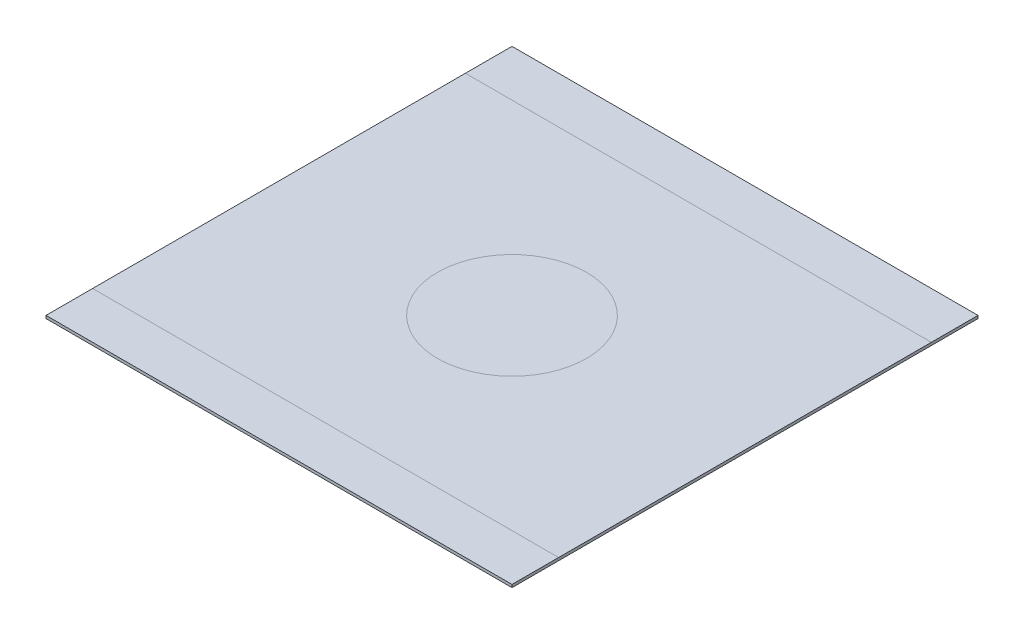
ISO-10303-21;
HEADER;
FILE_DESCRIPTION(('STEP AP214'),'2;1');
FILE_NAME('part.step','',(''),(''),'','','');
FILE_SCHEMA(('AUTOMOTIVE_DESIGN { 1 0 10303 214 1 1 1 1 }'));
ENDSEC;
DATA;
#1=APPLICATION_CONTEXT('core data for automotive mechanical design processes');
#2=APPLICATION_PROTOCOL_DEFINITION('international standard','automotive_design',2000,#1);
#3=PRODUCT_CONTEXT('',#1,'mechanical');
#4=PRODUCT('Part','Part','',(#3));
#5=PRODUCT_RELATED_PRODUCT_CATEGORY('part','',(#4));
#6=PRODUCT_DEFINITION_FORMATION('','',#4);
#7=PRODUCT_DEFINITION_CONTEXT('part definition',#1,'design');
#8=PRODUCT_DEFINITION('design','',#6,#7);
#9=PRODUCT_DEFINITION_SHAPE('','',#8);
#10=(LENGTH_UNIT() NAMED_UNIT(*) SI_UNIT(.MILLI.,.METRE.));
#11=(NAMED_UNIT(*) PLANE_ANGLE_UNIT() SI_UNIT($,.RADIAN.));
#12=(NAMED_UNIT(*) SI_UNIT($,.STERADIAN.) SOLID_ANGLE_UNIT());
#13=UNCERTAINTY_MEASURE_WITH_UNIT(LENGTH_MEASURE(1.E-05),#10,'distance_accuracy_value','');
#14=(GEOMETRIC_REPRESENTATION_CONTEXT(3) GLOBAL_UNCERTAINTY_ASSIGNED_CONTEXT((#13)) GLOBAL_UNIT_ASSIGNED_CONTEXT((#10,
#11,#12)) REPRESENTATION_CONTEXT('',''));
#15=CARTESIAN_POINT('',(0.,0.,0.));
#16=DIRECTION('',(0.,0.,1.));
#17=DIRECTION('',(1.,0.,0.));
#18=AXIS2_PLACEMENT_3D('',#15,#16,#17);
#19=CARTESIAN_POINT('',(0.,0.75,0.));
#20=DIRECTION('',(0.,-1.,0.));
#21=DIRECTION('',(0.,0.,-1.));
#22=AXIS2_PLACEMENT_3D('',#19,#20,#21);
#23=PLANE('',#22);
#24=DIRECTION('',(1.,0.,0.));
#25=VECTOR('',#24,1.);
#26=CARTESIAN_POINT('',(0.,0.75,-100.));
#27=LINE('',#26,#25);
#28=CARTESIAN_POINT('',(-125.,0.75,-100.));
#29=VERTEX_POINT('',#28);
#30=CARTESIAN_POINT('',(125.,0.75,-100.));
#31=VERTEX_POINT('',#30);
#32=EDGE_CURVE('E52',#29,#31,#27,.T.);
#33=ORIENTED_EDGE('',*,*,#32,.F.);
#34=DIRECTION('',(0.,0.,1.));
#35=VECTOR('',#34,1.);
#36=CARTESIAN_POINT('',(-125.,0.75,125.));
#37=LINE('',#36,#35);
#38=CARTESIAN_POINT('',(-125.,0.75,99.9999999999999));
#39=VERTEX_POINT('',#38);
#40=EDGE_CURVE('E145',#29,#39,#37,.T.);
#41=ORIENTED_EDGE('',*,*,#40,.T.);
#42=DIRECTION('',(-1.,0.,0.));
#43=VECTOR('',#42,1.);
#44=CARTESIAN_POINT('',(0.,0.75,99.9999999999999));
#45=LINE('',#44,#43);
#46=CARTESIAN_POINT('',(125.,0.75,99.9999999999999));
#47=VERTEX_POINT('',#46);
#48=EDGE_CURVE('E117',#47,#39,#45,.T.);
#49=ORIENTED_EDGE('',*,*,#48,.F.);
#50=DIRECTION('',(0.,0.,-1.));
#51=VECTOR('',#50,1.);
#52=CARTESIAN_POINT('',(125.,0.75,125.));
#53=LINE('',#52,#51);
#54=EDGE_CURVE('E100',#47,#31,#53,.T.);
#55=ORIENTED_EDGE('',*,*,#54,.T.);
#56=EDGE_LOOP('',(#33,#41,#49,#55));
#57=FACE_BOUND('',#56,.T.);
#58=CARTESIAN_POINT('',(0.,0.75,0.));
#59=DIRECTION('',(0.,-1.,0.));
#60=DIRECTION('',(0.,0.,-1.));
#61=AXIS2_PLACEMENT_3D('',#58,#59,#60);
#62=CIRCLE('',#61,40.);
#63=CARTESIAN_POINT('',(0.,0.75,-40.));
#64=VERTEX_POINT('',#63);
#65=EDGE_CURVE('E11',#64,#64,#62,.F.);
#66=ORIENTED_EDGE('',*,*,#65,.F.);
#67=EDGE_LOOP('',(#66));
#68=FACE_BOUND('',#67,.T.);
#69=ADVANCED_FACE('F43',(#57,#68),#23,.F.);
#70=ORIENTED_EDGE('',*,*,#65,.T.);
#71=EDGE_LOOP('',(#70));
#72=FACE_BOUND('',#71,.T.);
#73=ADVANCED_FACE('F173',(#72),#23,.F.);
#74=CARTESIAN_POINT('',(-125.,0.75,-125.));
#75=VERTEX_POINT('',#74);
#76=EDGE_CURVE('E144',#75,#29,#37,.T.);
#77=ORIENTED_EDGE('',*,*,#76,.T.);
#78=ORIENTED_EDGE('',*,*,#32,.T.);
#79=CARTESIAN_POINT('',(125.,0.75,-125.));
#80=VERTEX_POINT('',#79);
#81=EDGE_CURVE('E92',#31,#80,#53,.T.);
#82=ORIENTED_EDGE('',*,*,#81,.T.);
#83=DIRECTION('',(-1.,0.,0.));
#84=VECTOR('',#83,1.);
#85=CARTESIAN_POINT('',(-125.,0.75,-125.));
#86=LINE('',#85,#84);
#87=EDGE_CURVE('E95',#80,#75,#86,.T.);
#88=ORIENTED_EDGE('',*,*,#87,.T.);
#89=EDGE_LOOP('',(#77,#78,#82,#88));
#90=FACE_BOUND('',#89,.T.);
#91=ADVANCED_FACE('F94',(#90),#23,.F.);
#92=CARTESIAN_POINT('',(125.,0.75,125.));
#93=DIRECTION('',(-1.,0.,0.));
#94=DIRECTION('',(0.,0.,1.));
#95=AXIS2_PLACEMENT_3D('',#92,#93,#94);
#96=PLANE('',#95);
#97=DIRECTION('',(0.,0.,-1.));
#98=VECTOR('',#97,1.);
#99=CARTESIAN_POINT('',(125.,-0.75,125.));
#100=LINE('',#99,#98);
#101=CARTESIAN_POINT('',(125.,-0.75,125.));
#102=VERTEX_POINT('',#101);
#103=CARTESIAN_POINT('',(125.,-0.75,-125.));
#104=VERTEX_POINT('',#103);
#105=EDGE_CURVE('E116',#102,#104,#100,.T.);
#106=ORIENTED_EDGE('',*,*,#105,.T.);
#107=DIRECTION('',(0.,-1.,0.));
#108=VECTOR('',#107,1.);
#109=CARTESIAN_POINT('',(125.,0.75,-125.));
#110=LINE('',#109,#108);
#111=EDGE_CURVE('E107',#80,#104,#110,.T.);
#112=ORIENTED_EDGE('',*,*,#111,.F.);
#113=ORIENTED_EDGE('',*,*,#81,.F.);
#114=ORIENTED_EDGE('',*,*,#54,.F.);
#115=CARTESIAN_POINT('',(125.,0.75,125.));
#116=VERTEX_POINT('',#115);
#117=EDGE_CURVE('E103',#116,#47,#53,.T.);
#118=ORIENTED_EDGE('',*,*,#117,.F.);
#119=DIRECTION('',(0.,-1.,0.));
#120=VECTOR('',#119,1.);
#121=CARTESIAN_POINT('',(125.,0.75,125.));
#122=LINE('',#121,#120);
#123=EDGE_CURVE('E134',#116,#102,#122,.T.);
#124=ORIENTED_EDGE('',*,*,#123,.T.);
#125=EDGE_LOOP('',(#106,#112,#113,#114,#118,#124));
#126=FACE_BOUND('',#125,.T.);
#127=ADVANCED_FACE('F45',(#126),#96,.F.);
#128=CARTESIAN_POINT('',(-125.,0.75,-125.));
#129=DIRECTION('',(0.,0.,1.));
#130=DIRECTION('',(1.,0.,0.));
#131=AXIS2_PLACEMENT_3D('',#128,#129,#130);
#132=PLANE('',#131);
#133=DIRECTION('',(-1.,0.,0.));
#134=VECTOR('',#133,1.);
#135=CARTESIAN_POINT('',(-125.,-0.75,-125.));
#136=LINE('',#135,#134);
#137=CARTESIAN_POINT('',(-125.,-0.75,-125.));
#138=VERTEX_POINT('',#137);
#139=EDGE_CURVE('E140',#104,#138,#136,.T.);
#140=ORIENTED_EDGE('',*,*,#139,.T.);
#141=DIRECTION('',(0.,-1.,0.));
#142=VECTOR('',#141,1.);
#143=CARTESIAN_POINT('',(-125.,0.75,-125.));
#144=LINE('',#143,#142);
#145=EDGE_CURVE('E110',#75,#138,#144,.T.);
#146=ORIENTED_EDGE('',*,*,#145,.F.);
#147=ORIENTED_EDGE('',*,*,#87,.F.);
#148=ORIENTED_EDGE('',*,*,#111,.T.);
#149=EDGE_LOOP('',(#140,#146,#147,#148));
#150=FACE_BOUND('',#149,.T.);
#151=ADVANCED_FACE('F106',(#150),#132,.F.);
#152=CARTESIAN_POINT('',(-125.,0.75,125.));
#153=DIRECTION('',(1.,0.,0.));
#154=DIRECTION('',(0.,0.,-1.));
#155=AXIS2_PLACEMENT_3D('',#152,#153,#154);
#156=PLANE('',#155);
#157=DIRECTION('',(0.,0.,1.));
#158=VECTOR('',#157,1.);
#159=CARTESIAN_POINT('',(-125.,-0.75,125.));
#160=LINE('',#159,#158);
#161=CARTESIAN_POINT('',(-125.,-0.75,125.));
#162=VERTEX_POINT('',#161);
#163=EDGE_CURVE('E138',#138,#162,#160,.T.);
#164=ORIENTED_EDGE('',*,*,#163,.T.);
#165=DIRECTION('',(0.,-1.,0.));
#166=VECTOR('',#165,1.);
#167=CARTESIAN_POINT('',(-125.,0.75,125.));
#168=LINE('',#167,#166);
#169=CARTESIAN_POINT('',(-125.,0.75,125.));
#170=VERTEX_POINT('',#169);
#171=EDGE_CURVE('E122',#170,#162,#168,.T.);
#172=ORIENTED_EDGE('',*,*,#171,.F.);
#173=EDGE_CURVE('E112',#39,#170,#37,.T.);
#174=ORIENTED_EDGE('',*,*,#173,.F.);
#175=ORIENTED_EDGE('',*,*,#40,.F.);
#176=ORIENTED_EDGE('',*,*,#76,.F.);
#177=ORIENTED_EDGE('',*,*,#145,.T.);
#178=EDGE_LOOP('',(#164,#172,#174,#175,#176,#177));
#179=FACE_BOUND('',#178,.T.);
#180=ADVANCED_FACE('F158',(#179),#156,.F.);
#181=CARTESIAN_POINT('',(-125.,0.75,125.));
#182=DIRECTION('',(0.,0.,-1.));
#183=DIRECTION('',(-1.,0.,0.));
#184=AXIS2_PLACEMENT_3D('',#181,#182,#183);
#185=PLANE('',#184);
#186=DIRECTION('',(1.,0.,0.));
#187=VECTOR('',#186,1.);
#188=CARTESIAN_POINT('',(-125.,-0.75,125.));
#189=LINE('',#188,#187);
#190=EDGE_CURVE('E101',#162,#102,#189,.T.);
#191=ORIENTED_EDGE('',*,*,#190,.T.);
#192=ORIENTED_EDGE('',*,*,#123,.F.);
#193=DIRECTION('',(1.,0.,0.));
#194=VECTOR('',#193,1.);
#195=CARTESIAN_POINT('',(-125.,0.75,125.));
#196=LINE('',#195,#194);
#197=EDGE_CURVE('E136',#170,#116,#196,.T.);
#198=ORIENTED_EDGE('',*,*,#197,.F.);
#199=ORIENTED_EDGE('',*,*,#171,.T.);
#200=EDGE_LOOP('',(#191,#192,#198,#199));
#201=FACE_BOUND('',#200,.T.);
#202=ADVANCED_FACE('F162',(#201),#185,.F.);
#203=ORIENTED_EDGE('',*,*,#117,.T.);
#204=ORIENTED_EDGE('',*,*,#48,.T.);
#205=ORIENTED_EDGE('',*,*,#173,.T.);
#206=ORIENTED_EDGE('',*,*,#197,.T.);
#207=EDGE_LOOP('',(#203,#204,#205,#206));
#208=FACE_BOUND('',#207,.T.);
#209=ADVANCED_FACE('F161',(#208),#23,.F.);
#210=CARTESIAN_POINT('',(0.,-0.75,0.));
#211=DIRECTION('',(0.,-1.,0.));
#212=DIRECTION('',(0.,0.,-1.));
#213=AXIS2_PLACEMENT_3D('',#210,#211,#212);
#214=PLANE('',#213);
#215=ORIENTED_EDGE('',*,*,#105,.F.);
#216=ORIENTED_EDGE('',*,*,#190,.F.);
#217=ORIENTED_EDGE('',*,*,#163,.F.);
#218=ORIENTED_EDGE('',*,*,#139,.F.);
#219=EDGE_LOOP('',(#215,#216,#217,#218));
#220=FACE_BOUND('',#219,.T.);
#221=ADVANCED_FACE('F155',(#220),#214,.T.);
#222=CLOSED_SHELL('',(#69,#73,#91,#127,#151,#180,#202,#209,#221));
#223=MANIFOLD_SOLID_BREP('B2',#222);
#224=ADVANCED_BREP_SHAPE_REPRESENTATION('',(#18,#223),#14);
#225=SHAPE_DEFINITION_REPRESENTATION(#9,#224);
ENDSEC;
END-ISO-10303-21;
